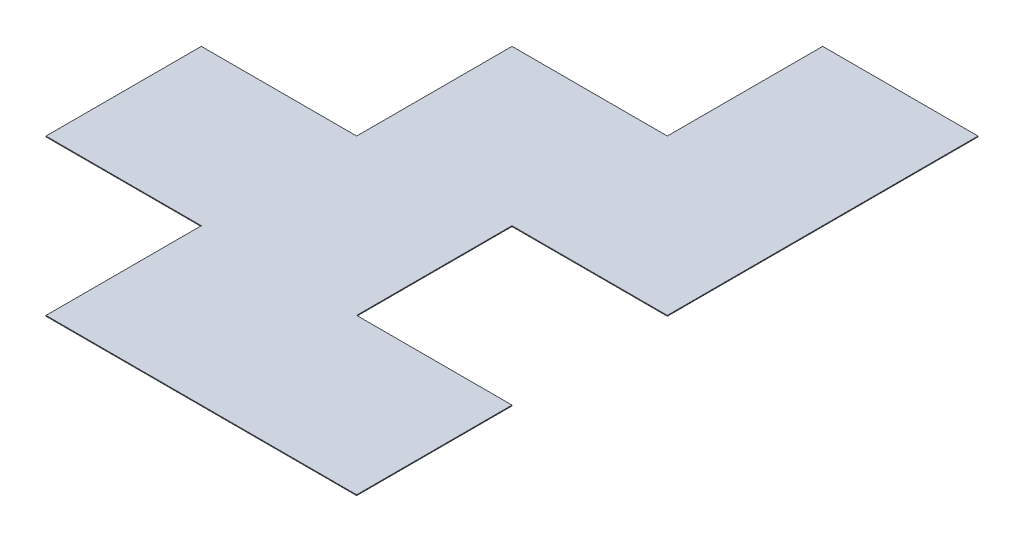
ISO-10303-21;
HEADER;
FILE_DESCRIPTION(('STEP AP214'),'2;1');
FILE_NAME('part.step','',(''),(''),'','','');
FILE_SCHEMA(('AUTOMOTIVE_DESIGN { 1 0 10303 214 1 1 1 1 }'));
ENDSEC;
DATA;
#1=APPLICATION_CONTEXT('core data for automotive mechanical design processes');
#2=APPLICATION_PROTOCOL_DEFINITION('international standard','automotive_design',2000,#1);
#3=PRODUCT_CONTEXT('',#1,'mechanical');
#4=PRODUCT('Part','Part','',(#3));
#5=PRODUCT_RELATED_PRODUCT_CATEGORY('part','',(#4));
#6=PRODUCT_DEFINITION_FORMATION('','',#4);
#7=PRODUCT_DEFINITION_CONTEXT('part definition',#1,'design');
#8=PRODUCT_DEFINITION('design','',#6,#7);
#9=PRODUCT_DEFINITION_SHAPE('','',#8);
#10=(LENGTH_UNIT() NAMED_UNIT(*) SI_UNIT(.MILLI.,.METRE.));
#11=(NAMED_UNIT(*) PLANE_ANGLE_UNIT() SI_UNIT($,.RADIAN.));
#12=(NAMED_UNIT(*) SI_UNIT($,.STERADIAN.) SOLID_ANGLE_UNIT());
#13=UNCERTAINTY_MEASURE_WITH_UNIT(LENGTH_MEASURE(1.E-05),#10,'distance_accuracy_value','');
#14=(GEOMETRIC_REPRESENTATION_CONTEXT(3) GLOBAL_UNCERTAINTY_ASSIGNED_CONTEXT((#13)) GLOBAL_UNIT_ASSIGNED_CONTEXT((#10,
#11,#12)) REPRESENTATION_CONTEXT('',''));
#15=CARTESIAN_POINT('',(0.,0.,0.));
#16=DIRECTION('',(0.,0.,1.));
#17=DIRECTION('',(1.,0.,0.));
#18=AXIS2_PLACEMENT_3D('',#15,#16,#17);
#19=CARTESIAN_POINT('',(5.77318429210503,2.601,3.25483545486294E-13));
#20=DIRECTION('',(1.,0.,0.));
#21=DIRECTION('',(0.,0.,-1.));
#22=AXIS2_PLACEMENT_3D('',#19,#20,#21);
#23=PLANE('',#22);
#24=DIRECTION('',(0.,0.,1.));
#25=VECTOR('',#24,1.);
#26=CARTESIAN_POINT('',(5.77318429210503,2.6,3.25483545486294E-13));
#27=LINE('',#26,#25);
#28=CARTESIAN_POINT('',(5.773184292105,2.6,0.319070689291639));
#29=VERTEX_POINT('',#28);
#30=CARTESIAN_POINT('',(5.77318429210499,2.6,0.719070689291636));
#31=VERTEX_POINT('',#30);
#32=EDGE_CURVE('E11',#29,#31,#27,.T.);
#33=ORIENTED_EDGE('',*,*,#32,.F.);
#34=DIRECTION('',(0.,-1.,0.));
#35=VECTOR('',#34,1.);
#36=CARTESIAN_POINT('',(5.773184292105,2.601,0.319070689291639));
#37=LINE('',#36,#35);
#38=CARTESIAN_POINT('',(5.773184292105,2.601,0.319070689291639));
#39=VERTEX_POINT('',#38);
#40=EDGE_CURVE('E24',#39,#29,#37,.T.);
#41=ORIENTED_EDGE('',*,*,#40,.F.);
#42=DIRECTION('',(0.,0.,1.));
#43=VECTOR('',#42,1.);
#44=CARTESIAN_POINT('',(5.77318429210503,2.601,3.25483545486294E-13));
#45=LINE('',#44,#43);
#46=CARTESIAN_POINT('',(5.77318429210499,2.601,0.719070689291636));
#47=VERTEX_POINT('',#46);
#48=EDGE_CURVE('E233',#39,#47,#45,.T.);
#49=ORIENTED_EDGE('',*,*,#48,.T.);
#50=DIRECTION('',(0.,-1.,0.));
#51=VECTOR('',#50,1.);
#52=CARTESIAN_POINT('',(5.77318429210499,2.601,0.719070689291636));
#53=LINE('',#52,#51);
#54=EDGE_CURVE('E138',#47,#31,#53,.T.);
#55=ORIENTED_EDGE('',*,*,#54,.T.);
#56=EDGE_LOOP('',(#33,#41,#49,#55));
#57=FACE_BOUND('',#56,.T.);
#58=ADVANCED_FACE('F17',(#57),#23,.T.);
#59=CARTESIAN_POINT('',(0.,2.601,0.319070689291639));
#60=DIRECTION('',(0.,0.,-1.));
#61=DIRECTION('',(-1.,0.,0.));
#62=AXIS2_PLACEMENT_3D('',#59,#60,#61);
#63=PLANE('',#62);
#64=DIRECTION('',(1.,0.,0.));
#65=VECTOR('',#64,1.);
#66=CARTESIAN_POINT('',(0.,2.6,0.319070689291639));
#67=LINE('',#66,#65);
#68=CARTESIAN_POINT('',(5.57318429210534,2.6,0.319070689291639));
#69=VERTEX_POINT('',#68);
#70=EDGE_CURVE('E230',#69,#29,#67,.T.);
#71=ORIENTED_EDGE('',*,*,#70,.F.);
#72=DIRECTION('',(0.,-1.,0.));
#73=VECTOR('',#72,1.);
#74=CARTESIAN_POINT('',(5.57318429210534,2.601,0.319070689291639));
#75=LINE('',#74,#73);
#76=CARTESIAN_POINT('',(5.57318429210534,2.601,0.319070689291639));
#77=VERTEX_POINT('',#76);
#78=EDGE_CURVE('E227',#77,#69,#75,.T.);
#79=ORIENTED_EDGE('',*,*,#78,.F.);
#80=DIRECTION('',(1.,0.,0.));
#81=VECTOR('',#80,1.);
#82=CARTESIAN_POINT('',(0.,2.601,0.319070689291639));
#83=LINE('',#82,#81);
#84=EDGE_CURVE('E224',#77,#39,#83,.T.);
#85=ORIENTED_EDGE('',*,*,#84,.T.);
#86=ORIENTED_EDGE('',*,*,#40,.T.);
#87=EDGE_LOOP('',(#71,#79,#85,#86));
#88=FACE_BOUND('',#87,.T.);
#89=ADVANCED_FACE('F235',(#88),#63,.T.);
#90=CARTESIAN_POINT('',(5.57318429210536,2.601,3.38377676961115E-13));
#91=DIRECTION('',(1.,0.,0.));
#92=DIRECTION('',(0.,0.,-1.));
#93=AXIS2_PLACEMENT_3D('',#90,#91,#92);
#94=PLANE('',#93);
#95=DIRECTION('',(0.,0.,1.));
#96=VECTOR('',#95,1.);
#97=CARTESIAN_POINT('',(5.57318429210536,2.6,3.38377676961115E-13));
#98=LINE('',#97,#96);
#99=CARTESIAN_POINT('',(5.57318429210533,2.6,0.519070689291638));
#100=VERTEX_POINT('',#99);
#101=EDGE_CURVE('E222',#69,#100,#98,.T.);
#102=ORIENTED_EDGE('',*,*,#101,.T.);
#103=DIRECTION('',(0.,-1.,0.));
#104=VECTOR('',#103,1.);
#105=CARTESIAN_POINT('',(5.57318429210533,2.601,0.519070689291638));
#106=LINE('',#105,#104);
#107=CARTESIAN_POINT('',(5.57318429210533,2.601,0.519070689291638));
#108=VERTEX_POINT('',#107);
#109=EDGE_CURVE('E219',#108,#100,#106,.T.);
#110=ORIENTED_EDGE('',*,*,#109,.F.);
#111=DIRECTION('',(0.,0.,1.));
#112=VECTOR('',#111,1.);
#113=CARTESIAN_POINT('',(5.57318429210536,2.601,3.38377676961115E-13));
#114=LINE('',#113,#112);
#115=EDGE_CURVE('E216',#77,#108,#114,.T.);
#116=ORIENTED_EDGE('',*,*,#115,.F.);
#117=ORIENTED_EDGE('',*,*,#78,.T.);
#118=EDGE_LOOP('',(#102,#110,#116,#117));
#119=FACE_BOUND('',#118,.T.);
#120=ADVANCED_FACE('F241',(#119),#94,.F.);
#121=CARTESIAN_POINT('',(0.,2.601,0.519070689291638));
#122=DIRECTION('',(0.,0.,-1.));
#123=DIRECTION('',(-1.,0.,0.));
#124=AXIS2_PLACEMENT_3D('',#121,#122,#123);
#125=PLANE('',#124);
#126=DIRECTION('',(1.,0.,0.));
#127=VECTOR('',#126,1.);
#128=CARTESIAN_POINT('',(0.,2.6,0.519070689291638));
#129=LINE('',#128,#127);
#130=CARTESIAN_POINT('',(5.37318429210568,2.6,0.519070689291638));
#131=VERTEX_POINT('',#130);
#132=EDGE_CURVE('E213',#131,#100,#129,.T.);
#133=ORIENTED_EDGE('',*,*,#132,.F.);
#134=DIRECTION('',(0.,-1.,0.));
#135=VECTOR('',#134,1.);
#136=CARTESIAN_POINT('',(5.37318429210568,2.601,0.519070689291638));
#137=LINE('',#136,#135);
#138=CARTESIAN_POINT('',(5.37318429210568,2.601,0.519070689291638));
#139=VERTEX_POINT('',#138);
#140=EDGE_CURVE('E210',#139,#131,#137,.T.);
#141=ORIENTED_EDGE('',*,*,#140,.F.);
#142=DIRECTION('',(1.,0.,0.));
#143=VECTOR('',#142,1.);
#144=CARTESIAN_POINT('',(0.,2.601,0.519070689291638));
#145=LINE('',#144,#143);
#146=EDGE_CURVE('E207',#139,#108,#145,.T.);
#147=ORIENTED_EDGE('',*,*,#146,.T.);
#148=ORIENTED_EDGE('',*,*,#109,.T.);
#149=EDGE_LOOP('',(#133,#141,#147,#148));
#150=FACE_BOUND('',#149,.T.);
#151=ADVANCED_FACE('F244',(#150),#125,.T.);
#152=CARTESIAN_POINT('',(5.37318429210571,2.601,3.02932140298634E-13));
#153=DIRECTION('',(1.,0.,0.));
#154=DIRECTION('',(0.,0.,-1.));
#155=AXIS2_PLACEMENT_3D('',#152,#153,#154);
#156=PLANE('',#155);
#157=DIRECTION('',(0.,0.,1.));
#158=VECTOR('',#157,1.);
#159=CARTESIAN_POINT('',(5.37318429210571,2.6,3.02932140298634E-13));
#160=LINE('',#159,#158);
#161=CARTESIAN_POINT('',(5.37318429210567,2.6,0.719070689291636));
#162=VERTEX_POINT('',#161);
#163=EDGE_CURVE('E205',#131,#162,#160,.T.);
#164=ORIENTED_EDGE('',*,*,#163,.T.);
#165=DIRECTION('',(0.,-1.,0.));
#166=VECTOR('',#165,1.);
#167=CARTESIAN_POINT('',(5.37318429210567,2.601,0.719070689291636));
#168=LINE('',#167,#166);
#169=CARTESIAN_POINT('',(5.37318429210567,2.601,0.719070689291636));
#170=VERTEX_POINT('',#169);
#171=EDGE_CURVE('E202',#170,#162,#168,.T.);
#172=ORIENTED_EDGE('',*,*,#171,.F.);
#173=DIRECTION('',(0.,0.,1.));
#174=VECTOR('',#173,1.);
#175=CARTESIAN_POINT('',(5.37318429210571,2.601,3.02932140298634E-13));
#176=LINE('',#175,#174);
#177=EDGE_CURVE('E199',#139,#170,#176,.T.);
#178=ORIENTED_EDGE('',*,*,#177,.F.);
#179=ORIENTED_EDGE('',*,*,#140,.T.);
#180=EDGE_LOOP('',(#164,#172,#178,#179));
#181=FACE_BOUND('',#180,.T.);
#182=ADVANCED_FACE('F249',(#181),#156,.F.);
#183=CARTESIAN_POINT('',(0.,2.601,0.719070689291636));
#184=DIRECTION('',(0.,0.,-1.));
#185=DIRECTION('',(-1.,0.,0.));
#186=AXIS2_PLACEMENT_3D('',#183,#184,#185);
#187=PLANE('',#186);
#188=DIRECTION('',(1.,0.,0.));
#189=VECTOR('',#188,1.);
#190=CARTESIAN_POINT('',(0.,2.6,0.719070689291636));
#191=LINE('',#190,#189);
#192=CARTESIAN_POINT('',(5.17318429210601,2.6,0.719070689291636));
#193=VERTEX_POINT('',#192);
#194=EDGE_CURVE('E196',#193,#162,#191,.T.);
#195=ORIENTED_EDGE('',*,*,#194,.F.);
#196=DIRECTION('',(0.,-1.,0.));
#197=VECTOR('',#196,1.);
#198=CARTESIAN_POINT('',(5.17318429210601,2.601,0.719070689291636));
#199=LINE('',#198,#197);
#200=CARTESIAN_POINT('',(5.17318429210601,2.601,0.719070689291636));
#201=VERTEX_POINT('',#200);
#202=EDGE_CURVE('E193',#201,#193,#199,.T.);
#203=ORIENTED_EDGE('',*,*,#202,.F.);
#204=DIRECTION('',(1.,0.,0.));
#205=VECTOR('',#204,1.);
#206=CARTESIAN_POINT('',(0.,2.601,0.719070689291636));
#207=LINE('',#206,#205);
#208=EDGE_CURVE('E190',#201,#170,#207,.T.);
#209=ORIENTED_EDGE('',*,*,#208,.T.);
#210=ORIENTED_EDGE('',*,*,#171,.T.);
#211=EDGE_LOOP('',(#195,#203,#209,#210));
#212=FACE_BOUND('',#211,.T.);
#213=ADVANCED_FACE('F251',(#212),#187,.T.);
#214=CARTESIAN_POINT('',(5.17318429210606,2.601,2.91656437704805E-13));
#215=DIRECTION('',(1.,0.,0.));
#216=DIRECTION('',(0.,0.,-1.));
#217=AXIS2_PLACEMENT_3D('',#214,#215,#216);
#218=PLANE('',#217);
#219=DIRECTION('',(0.,0.,1.));
#220=VECTOR('',#219,1.);
#221=CARTESIAN_POINT('',(5.17318429210606,2.6,2.91656437704805E-13));
#222=LINE('',#221,#220);
#223=CARTESIAN_POINT('',(5.17318429210601,2.6,0.919070689291635));
#224=VERTEX_POINT('',#223);
#225=EDGE_CURVE('E188',#193,#224,#222,.T.);
#226=ORIENTED_EDGE('',*,*,#225,.T.);
#227=DIRECTION('',(0.,-1.,0.));
#228=VECTOR('',#227,1.);
#229=CARTESIAN_POINT('',(5.17318429210601,2.601,0.919070689291635));
#230=LINE('',#229,#228);
#231=CARTESIAN_POINT('',(5.17318429210601,2.601,0.919070689291635));
#232=VERTEX_POINT('',#231);
#233=EDGE_CURVE('E185',#232,#224,#230,.T.);
#234=ORIENTED_EDGE('',*,*,#233,.F.);
#235=DIRECTION('',(0.,0.,1.));
#236=VECTOR('',#235,1.);
#237=CARTESIAN_POINT('',(5.17318429210606,2.601,2.91656437704805E-13));
#238=LINE('',#237,#236);
#239=EDGE_CURVE('E182',#201,#232,#238,.T.);
#240=ORIENTED_EDGE('',*,*,#239,.F.);
#241=ORIENTED_EDGE('',*,*,#202,.T.);
#242=EDGE_LOOP('',(#226,#234,#240,#241));
#243=FACE_BOUND('',#242,.T.);
#244=ADVANCED_FACE('F256',(#243),#218,.F.);
#245=CARTESIAN_POINT('',(0.,2.601,0.919070689291635));
#246=DIRECTION('',(0.,0.,-1.));
#247=DIRECTION('',(-1.,0.,0.));
#248=AXIS2_PLACEMENT_3D('',#245,#246,#247);
#249=PLANE('',#248);
#250=DIRECTION('',(1.,0.,0.));
#251=VECTOR('',#250,1.);
#252=CARTESIAN_POINT('',(0.,2.6,0.919070689291635));
#253=LINE('',#252,#251);
#254=CARTESIAN_POINT('',(5.37318429210567,2.6,0.919070689291635));
#255=VERTEX_POINT('',#254);
#256=EDGE_CURVE('E180',#224,#255,#253,.T.);
#257=ORIENTED_EDGE('',*,*,#256,.T.);
#258=DIRECTION('',(0.,-1.,0.));
#259=VECTOR('',#258,1.);
#260=CARTESIAN_POINT('',(5.37318429210567,2.601,0.919070689291635));
#261=LINE('',#260,#259);
#262=CARTESIAN_POINT('',(5.37318429210567,2.601,0.919070689291635));
#263=VERTEX_POINT('',#262);
#264=EDGE_CURVE('E177',#263,#255,#261,.T.);
#265=ORIENTED_EDGE('',*,*,#264,.F.);
#266=DIRECTION('',(1.,0.,0.));
#267=VECTOR('',#266,1.);
#268=CARTESIAN_POINT('',(0.,2.601,0.919070689291635));
#269=LINE('',#268,#267);
#270=EDGE_CURVE('E174',#232,#263,#269,.T.);
#271=ORIENTED_EDGE('',*,*,#270,.F.);
#272=ORIENTED_EDGE('',*,*,#233,.T.);
#273=EDGE_LOOP('',(#257,#265,#271,#272));
#274=FACE_BOUND('',#273,.T.);
#275=ADVANCED_FACE('F260',(#274),#249,.F.);
#276=CARTESIAN_POINT('',(5.37318429210573,2.601,3.02932140298636E-13));
#277=DIRECTION('',(1.,0.,0.));
#278=DIRECTION('',(0.,0.,-1.));
#279=AXIS2_PLACEMENT_3D('',#276,#277,#278);
#280=PLANE('',#279);
#281=DIRECTION('',(0.,0.,1.));
#282=VECTOR('',#281,1.);
#283=CARTESIAN_POINT('',(5.37318429210573,2.6,3.02932140298636E-13));
#284=LINE('',#283,#282);
#285=CARTESIAN_POINT('',(5.37318429210567,2.6,1.11907068929163));
#286=VERTEX_POINT('',#285);
#287=EDGE_CURVE('E172',#255,#286,#284,.T.);
#288=ORIENTED_EDGE('',*,*,#287,.T.);
#289=DIRECTION('',(0.,-1.,0.));
#290=VECTOR('',#289,1.);
#291=CARTESIAN_POINT('',(5.37318429210567,2.601,1.11907068929163));
#292=LINE('',#291,#290);
#293=CARTESIAN_POINT('',(5.37318429210567,2.601,1.11907068929163));
#294=VERTEX_POINT('',#293);
#295=EDGE_CURVE('E169',#294,#286,#292,.T.);
#296=ORIENTED_EDGE('',*,*,#295,.F.);
#297=DIRECTION('',(0.,0.,1.));
#298=VECTOR('',#297,1.);
#299=CARTESIAN_POINT('',(5.37318429210573,2.601,3.02932140298636E-13));
#300=LINE('',#299,#298);
#301=EDGE_CURVE('E166',#263,#294,#300,.T.);
#302=ORIENTED_EDGE('',*,*,#301,.F.);
#303=ORIENTED_EDGE('',*,*,#264,.T.);
#304=EDGE_LOOP('',(#288,#296,#302,#303));
#305=FACE_BOUND('',#304,.T.);
#306=ADVANCED_FACE('F264',(#305),#280,.F.);
#307=CARTESIAN_POINT('',(0.,2.601,1.11907068929163));
#308=DIRECTION('',(0.,0.,-1.));
#309=DIRECTION('',(-1.,0.,0.));
#310=AXIS2_PLACEMENT_3D('',#307,#308,#309);
#311=PLANE('',#310);
#312=DIRECTION('',(1.,0.,0.));
#313=VECTOR('',#312,1.);
#314=CARTESIAN_POINT('',(0.,2.6,1.11907068929163));
#315=LINE('',#314,#313);
#316=CARTESIAN_POINT('',(5.77318429210499,2.6,1.11907068929163));
#317=VERTEX_POINT('',#316);
#318=EDGE_CURVE('E164',#286,#317,#315,.T.);
#319=ORIENTED_EDGE('',*,*,#318,.T.);
#320=DIRECTION('',(0.,-1.,0.));
#321=VECTOR('',#320,1.);
#322=CARTESIAN_POINT('',(5.77318429210499,2.601,1.11907068929163));
#323=LINE('',#322,#321);
#324=CARTESIAN_POINT('',(5.77318429210499,2.601,1.11907068929163));
#325=VERTEX_POINT('',#324);
#326=EDGE_CURVE('E161',#325,#317,#323,.T.);
#327=ORIENTED_EDGE('',*,*,#326,.F.);
#328=DIRECTION('',(1.,0.,0.));
#329=VECTOR('',#328,1.);
#330=CARTESIAN_POINT('',(0.,2.601,1.11907068929163));
#331=LINE('',#330,#329);
#332=EDGE_CURVE('E158',#294,#325,#331,.T.);
#333=ORIENTED_EDGE('',*,*,#332,.F.);
#334=ORIENTED_EDGE('',*,*,#295,.T.);
#335=EDGE_LOOP('',(#319,#327,#333,#334));
#336=FACE_BOUND('',#335,.T.);
#337=ADVANCED_FACE('F267',(#336),#311,.F.);
#338=CARTESIAN_POINT('',(5.77318429210505,2.601,3.25483545486296E-13));
#339=DIRECTION('',(1.,0.,0.));
#340=DIRECTION('',(0.,0.,-1.));
#341=AXIS2_PLACEMENT_3D('',#338,#339,#340);
#342=PLANE('',#341);
#343=DIRECTION('',(0.,0.,1.));
#344=VECTOR('',#343,1.);
#345=CARTESIAN_POINT('',(5.77318429210505,2.6,3.25483545486296E-13));
#346=LINE('',#345,#344);
#347=CARTESIAN_POINT('',(5.77318429210499,2.6,0.919070689291635));
#348=VERTEX_POINT('',#347);
#349=EDGE_CURVE('E155',#348,#317,#346,.T.);
#350=ORIENTED_EDGE('',*,*,#349,.F.);
#351=DIRECTION('',(0.,-1.,0.));
#352=VECTOR('',#351,1.);
#353=CARTESIAN_POINT('',(5.77318429210499,2.601,0.919070689291635));
#354=LINE('',#353,#352);
#355=CARTESIAN_POINT('',(5.77318429210499,2.601,0.919070689291635));
#356=VERTEX_POINT('',#355);
#357=EDGE_CURVE('E152',#356,#348,#354,.T.);
#358=ORIENTED_EDGE('',*,*,#357,.F.);
#359=DIRECTION('',(0.,0.,1.));
#360=VECTOR('',#359,1.);
#361=CARTESIAN_POINT('',(5.77318429210505,2.601,3.25483545486296E-13));
#362=LINE('',#361,#360);
#363=EDGE_CURVE('E149',#356,#325,#362,.T.);
#364=ORIENTED_EDGE('',*,*,#363,.T.);
#365=ORIENTED_EDGE('',*,*,#326,.T.);
#366=EDGE_LOOP('',(#350,#358,#364,#365));
#367=FACE_BOUND('',#366,.T.);
#368=ADVANCED_FACE('F269',(#367),#342,.T.);
#369=CARTESIAN_POINT('',(0.,2.601,0.919070689291635));
#370=DIRECTION('',(0.,0.,-1.));
#371=DIRECTION('',(-1.,0.,0.));
#372=AXIS2_PLACEMENT_3D('',#369,#370,#371);
#373=PLANE('',#372);
#374=DIRECTION('',(1.,0.,0.));
#375=VECTOR('',#374,1.);
#376=CARTESIAN_POINT('',(0.,2.6,0.919070689291635));
#377=LINE('',#376,#375);
#378=CARTESIAN_POINT('',(5.57318429210533,2.6,0.919070689291635));
#379=VERTEX_POINT('',#378);
#380=EDGE_CURVE('E146',#379,#348,#377,.T.);
#381=ORIENTED_EDGE('',*,*,#380,.F.);
#382=DIRECTION('',(0.,-1.,0.));
#383=VECTOR('',#382,1.);
#384=CARTESIAN_POINT('',(5.57318429210533,2.601,0.919070689291635));
#385=LINE('',#384,#383);
#386=CARTESIAN_POINT('',(5.57318429210533,2.601,0.919070689291635));
#387=VERTEX_POINT('',#386);
#388=EDGE_CURVE('E144',#387,#379,#385,.T.);
#389=ORIENTED_EDGE('',*,*,#388,.F.);
#390=DIRECTION('',(1.,0.,0.));
#391=VECTOR('',#390,1.);
#392=CARTESIAN_POINT('',(0.,2.601,0.919070689291635));
#393=LINE('',#392,#391);
#394=EDGE_CURVE('E133',#387,#356,#393,.T.);
#395=ORIENTED_EDGE('',*,*,#394,.T.);
#396=ORIENTED_EDGE('',*,*,#357,.T.);
#397=EDGE_LOOP('',(#381,#389,#395,#396));
#398=FACE_BOUND('',#397,.T.);
#399=ADVANCED_FACE('F271',(#398),#373,.T.);
#400=CARTESIAN_POINT('',(5.57318429210538,2.601,3.38377676961117E-13));
#401=DIRECTION('',(1.,0.,0.));
#402=DIRECTION('',(0.,0.,-1.));
#403=AXIS2_PLACEMENT_3D('',#400,#401,#402);
#404=PLANE('',#403);
#405=DIRECTION('',(0.,0.,1.));
#406=VECTOR('',#405,1.);
#407=CARTESIAN_POINT('',(5.57318429210538,2.6,3.38377676961117E-13));
#408=LINE('',#407,#406);
#409=CARTESIAN_POINT('',(5.57318429210533,2.6,0.719070689291636));
#410=VERTEX_POINT('',#409);
#411=EDGE_CURVE('E120',#410,#379,#408,.T.);
#412=ORIENTED_EDGE('',*,*,#411,.F.);
#413=DIRECTION('',(0.,-1.,0.));
#414=VECTOR('',#413,1.);
#415=CARTESIAN_POINT('',(5.57318429210533,2.601,0.719070689291636));
#416=LINE('',#415,#414);
#417=CARTESIAN_POINT('',(5.57318429210533,2.601,0.719070689291636));
#418=VERTEX_POINT('',#417);
#419=EDGE_CURVE('E114',#418,#410,#416,.T.);
#420=ORIENTED_EDGE('',*,*,#419,.F.);
#421=DIRECTION('',(0.,0.,1.));
#422=VECTOR('',#421,1.);
#423=CARTESIAN_POINT('',(5.57318429210538,2.601,3.38377676961117E-13));
#424=LINE('',#423,#422);
#425=EDGE_CURVE('E118',#418,#387,#424,.T.);
#426=ORIENTED_EDGE('',*,*,#425,.T.);
#427=ORIENTED_EDGE('',*,*,#388,.T.);
#428=EDGE_LOOP('',(#412,#420,#426,#427));
#429=FACE_BOUND('',#428,.T.);
#430=ADVANCED_FACE('F116',(#429),#404,.T.);
#431=CARTESIAN_POINT('',(0.,2.601,0.719070689291636));
#432=DIRECTION('',(0.,0.,-1.));
#433=DIRECTION('',(-1.,0.,0.));
#434=AXIS2_PLACEMENT_3D('',#431,#432,#433);
#435=PLANE('',#434);
#436=DIRECTION('',(1.,0.,0.));
#437=VECTOR('',#436,1.);
#438=CARTESIAN_POINT('',(0.,2.6,0.719070689291636));
#439=LINE('',#438,#437);
#440=EDGE_CURVE('E134',#410,#31,#439,.T.);
#441=ORIENTED_EDGE('',*,*,#440,.T.);
#442=ORIENTED_EDGE('',*,*,#54,.F.);
#443=DIRECTION('',(1.,0.,0.));
#444=VECTOR('',#443,1.);
#445=CARTESIAN_POINT('',(0.,2.601,0.719070689291636));
#446=LINE('',#445,#444);
#447=EDGE_CURVE('E130',#418,#47,#446,.T.);
#448=ORIENTED_EDGE('',*,*,#447,.F.);
#449=ORIENTED_EDGE('',*,*,#419,.T.);
#450=EDGE_LOOP('',(#441,#442,#448,#449));
#451=FACE_BOUND('',#450,.T.);
#452=ADVANCED_FACE('F137',(#451),#435,.F.);
#453=CARTESIAN_POINT('',(0.,2.601,0.));
#454=DIRECTION('',(0.,1.,0.));
#455=DIRECTION('',(0.,0.,1.));
#456=AXIS2_PLACEMENT_3D('',#453,#454,#455);
#457=PLANE('',#456);
#458=ORIENTED_EDGE('',*,*,#48,.F.);
#459=ORIENTED_EDGE('',*,*,#84,.F.);
#460=ORIENTED_EDGE('',*,*,#115,.T.);
#461=ORIENTED_EDGE('',*,*,#146,.F.);
#462=ORIENTED_EDGE('',*,*,#177,.T.);
#463=ORIENTED_EDGE('',*,*,#208,.F.);
#464=ORIENTED_EDGE('',*,*,#239,.T.);
#465=ORIENTED_EDGE('',*,*,#270,.T.);
#466=ORIENTED_EDGE('',*,*,#301,.T.);
#467=ORIENTED_EDGE('',*,*,#332,.T.);
#468=ORIENTED_EDGE('',*,*,#363,.F.);
#469=ORIENTED_EDGE('',*,*,#394,.F.);
#470=ORIENTED_EDGE('',*,*,#425,.F.);
#471=ORIENTED_EDGE('',*,*,#447,.T.);
#472=EDGE_LOOP('',(#458,#459,#460,#461,#462,#463,#464,#465,#466,#467,#468,#469,#470,#471));
#473=FACE_BOUND('',#472,.T.);
#474=ADVANCED_FACE('F129',(#473),#457,.T.);
#475=CARTESIAN_POINT('',(0.,2.6,0.));
#476=DIRECTION('',(0.,1.,0.));
#477=DIRECTION('',(0.,0.,1.));
#478=AXIS2_PLACEMENT_3D('',#475,#476,#477);
#479=PLANE('',#478);
#480=ORIENTED_EDGE('',*,*,#32,.T.);
#481=ORIENTED_EDGE('',*,*,#440,.F.);
#482=ORIENTED_EDGE('',*,*,#411,.T.);
#483=ORIENTED_EDGE('',*,*,#380,.T.);
#484=ORIENTED_EDGE('',*,*,#349,.T.);
#485=ORIENTED_EDGE('',*,*,#318,.F.);
#486=ORIENTED_EDGE('',*,*,#287,.F.);
#487=ORIENTED_EDGE('',*,*,#256,.F.);
#488=ORIENTED_EDGE('',*,*,#225,.F.);
#489=ORIENTED_EDGE('',*,*,#194,.T.);
#490=ORIENTED_EDGE('',*,*,#163,.F.);
#491=ORIENTED_EDGE('',*,*,#132,.T.);
#492=ORIENTED_EDGE('',*,*,#101,.F.);
#493=ORIENTED_EDGE('',*,*,#70,.T.);
#494=EDGE_LOOP('',(#480,#481,#482,#483,#484,#485,#486,#487,#488,#489,#490,#491,#492,#493));
#495=FACE_BOUND('',#494,.T.);
#496=ADVANCED_FACE('F238',(#495),#479,.F.);
#497=CLOSED_SHELL('',(#58,#89,#120,#151,#182,#213,#244,#275,#306,#337,#368,#399,#430,#452,#474,#496));
#498=MANIFOLD_SOLID_BREP('B1',#497);
#499=ADVANCED_BREP_SHAPE_REPRESENTATION('',(#18,#498),#14);
#500=SHAPE_DEFINITION_REPRESENTATION(#9,#499);
ENDSEC;
END-ISO-10303-21;
